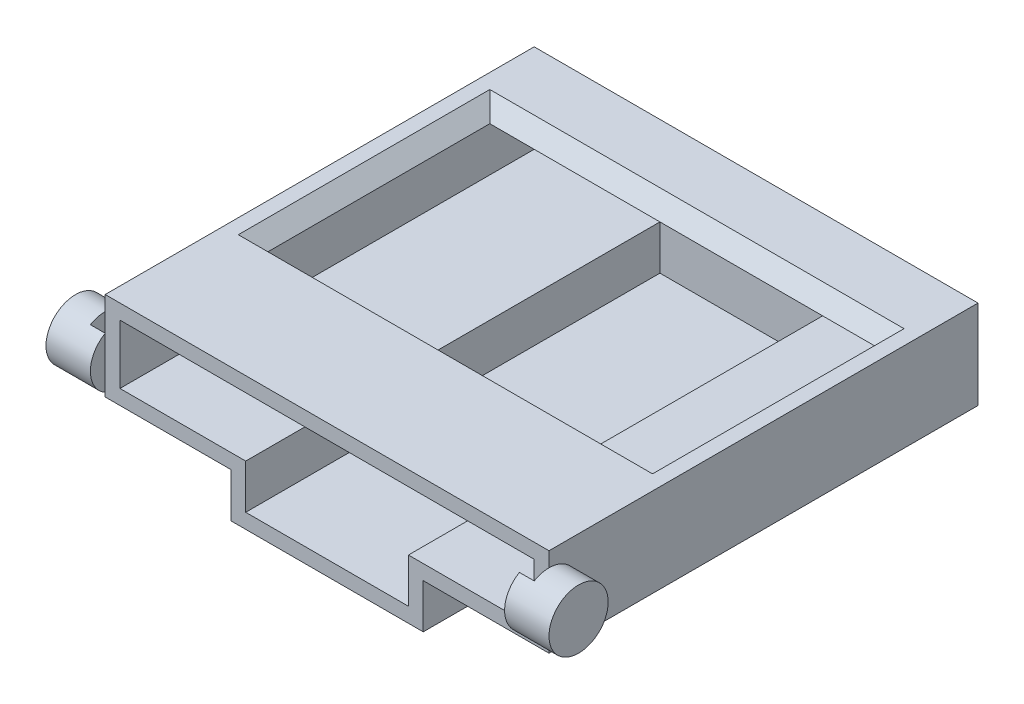
ISO-10303-21;
HEADER;
FILE_DESCRIPTION(('STEP AP214'),'2;1');
FILE_NAME('part.step','',(''),(''),'','','');
FILE_SCHEMA(('AUTOMOTIVE_DESIGN { 1 0 10303 214 1 1 1 1 }'));
ENDSEC;
DATA;
#1=APPLICATION_CONTEXT('core data for automotive mechanical design processes');
#2=APPLICATION_PROTOCOL_DEFINITION('international standard','automotive_design',2000,#1);
#3=PRODUCT_CONTEXT('',#1,'mechanical');
#4=PRODUCT('Part','Part','',(#3));
#5=PRODUCT_RELATED_PRODUCT_CATEGORY('part','',(#4));
#6=PRODUCT_DEFINITION_FORMATION('','',#4);
#7=PRODUCT_DEFINITION_CONTEXT('part definition',#1,'design');
#8=PRODUCT_DEFINITION('design','',#6,#7);
#9=PRODUCT_DEFINITION_SHAPE('','',#8);
#10=(LENGTH_UNIT() NAMED_UNIT(*) SI_UNIT(.MILLI.,.METRE.));
#11=(NAMED_UNIT(*) PLANE_ANGLE_UNIT() SI_UNIT($,.RADIAN.));
#12=(NAMED_UNIT(*) SI_UNIT($,.STERADIAN.) SOLID_ANGLE_UNIT());
#13=UNCERTAINTY_MEASURE_WITH_UNIT(LENGTH_MEASURE(1.E-05),#10,'distance_accuracy_value','');
#14=(GEOMETRIC_REPRESENTATION_CONTEXT(3) GLOBAL_UNCERTAINTY_ASSIGNED_CONTEXT((#13)) GLOBAL_UNIT_ASSIGNED_CONTEXT((#10,
#11,#12)) REPRESENTATION_CONTEXT('',''));
#15=CARTESIAN_POINT('',(0.,0.,0.));
#16=DIRECTION('',(0.,0.,1.));
#17=DIRECTION('',(1.,0.,0.));
#18=AXIS2_PLACEMENT_3D('',#15,#16,#17);
#19=CARTESIAN_POINT('',(1.,6.,0.));
#20=DIRECTION('',(1.,0.,0.));
#21=DIRECTION('',(0.,0.,-1.));
#22=AXIS2_PLACEMENT_3D('',#19,#20,#21);
#23=PLANE('',#22);
#24=DIRECTION('',(0.,1.,0.));
#25=VECTOR('',#24,1.);
#26=CARTESIAN_POINT('',(1.,-1.82620628999741,0.));
#27=LINE('',#26,#25);
#28=CARTESIAN_POINT('',(1.,1.,0.));
#29=VERTEX_POINT('',#28);
#30=CARTESIAN_POINT('',(1.,5.,0.));
#31=VERTEX_POINT('',#30);
#32=EDGE_CURVE('E206',#29,#31,#27,.T.);
#33=ORIENTED_EDGE('',*,*,#32,.F.);
#34=DIRECTION('',(0.,0.,1.));
#35=VECTOR('',#34,1.);
#36=CARTESIAN_POINT('',(1.,1.,0.));
#37=LINE('',#36,#35);
#38=CARTESIAN_POINT('',(1.,1.,-28.));
#39=VERTEX_POINT('',#38);
#40=EDGE_CURVE('E209',#39,#29,#37,.T.);
#41=ORIENTED_EDGE('',*,*,#40,.F.);
#42=DIRECTION('',(0.,-1.,0.));
#43=VECTOR('',#42,1.);
#44=CARTESIAN_POINT('',(1.,6.,-28.));
#45=LINE('',#44,#43);
#46=CARTESIAN_POINT('',(1.,5.,-28.));
#47=VERTEX_POINT('',#46);
#48=EDGE_CURVE('E419',#47,#39,#45,.T.);
#49=ORIENTED_EDGE('',*,*,#48,.F.);
#50=DIRECTION('',(0.,0.,1.));
#51=VECTOR('',#50,1.);
#52=CARTESIAN_POINT('',(1.,5.,0.));
#53=LINE('',#52,#51);
#54=EDGE_CURVE('E211',#47,#31,#53,.T.);
#55=ORIENTED_EDGE('',*,*,#54,.T.);
#56=EDGE_LOOP('',(#33,#41,#49,#55));
#57=FACE_BOUND('',#56,.T.);
#58=ADVANCED_FACE('F32',(#57),#23,.T.);
#59=CARTESIAN_POINT('',(29.,6.,0.));
#60=DIRECTION('',(-1.,0.,0.));
#61=DIRECTION('',(0.,0.,1.));
#62=AXIS2_PLACEMENT_3D('',#59,#60,#61);
#63=PLANE('',#62);
#64=DIRECTION('',(0.,1.,0.));
#65=VECTOR('',#64,1.);
#66=CARTESIAN_POINT('',(29.,0.503232974487844,1.));
#67=LINE('',#66,#65);
#68=CARTESIAN_POINT('',(29.,1.26794919243112,1.));
#69=VERTEX_POINT('',#68);
#70=CARTESIAN_POINT('',(29.,4.73205080756888,1.));
#71=VERTEX_POINT('',#70);
#72=EDGE_CURVE('E335',#69,#71,#67,.T.);
#73=ORIENTED_EDGE('',*,*,#72,.F.);
#74=CARTESIAN_POINT('',(29.,3.,0.));
#75=DIRECTION('',(1.,0.,0.));
#76=DIRECTION('',(0.,0.,-1.));
#77=AXIS2_PLACEMENT_3D('',#74,#75,#76);
#78=CIRCLE('',#77,2.);
#79=EDGE_CURVE('E352',#71,#69,#78,.T.);
#80=ORIENTED_EDGE('',*,*,#79,.F.);
#81=EDGE_LOOP('',(#73,#80));
#82=FACE_BOUND('',#81,.T.);
#83=ADVANCED_FACE('F462',(#82),#63,.T.);
#84=CARTESIAN_POINT('',(0.,1.,0.));
#85=DIRECTION('',(0.,-1.,0.));
#86=DIRECTION('',(0.,0.,-1.));
#87=AXIS2_PLACEMENT_3D('',#84,#85,#86);
#88=PLANE('',#87);
#89=DIRECTION('',(-1.,0.,0.));
#90=VECTOR('',#89,1.);
#91=CARTESIAN_POINT('',(0.,1.,-28.));
#92=LINE('',#91,#90);
#93=CARTESIAN_POINT('',(29.,1.,-28.));
#94=VERTEX_POINT('',#93);
#95=CARTESIAN_POINT('',(20.5,1.,-28.));
#96=VERTEX_POINT('',#95);
#97=EDGE_CURVE('E418',#94,#96,#92,.T.);
#98=ORIENTED_EDGE('',*,*,#97,.T.);
#99=DIRECTION('',(0.,0.,-1.));
#100=VECTOR('',#99,1.);
#101=CARTESIAN_POINT('',(20.5,1.,0.));
#102=LINE('',#101,#100);
#103=CARTESIAN_POINT('',(20.5,1.,0.));
#104=VERTEX_POINT('',#103);
#105=EDGE_CURVE('E358',#104,#96,#102,.T.);
#106=ORIENTED_EDGE('',*,*,#105,.F.);
#107=DIRECTION('',(1.,0.,0.));
#108=VECTOR('',#107,1.);
#109=CARTESIAN_POINT('',(0.,1.,0.));
#110=LINE('',#109,#108);
#111=CARTESIAN_POINT('',(29.,1.,0.));
#112=VERTEX_POINT('',#111);
#113=EDGE_CURVE('E226',#104,#112,#110,.T.);
#114=ORIENTED_EDGE('',*,*,#113,.T.);
#115=DIRECTION('',(0.,0.,-1.));
#116=VECTOR('',#115,1.);
#117=CARTESIAN_POINT('',(29.,1.,0.));
#118=LINE('',#117,#116);
#119=EDGE_CURVE('E234',#112,#94,#118,.T.);
#120=ORIENTED_EDGE('',*,*,#119,.T.);
#121=EDGE_LOOP('',(#98,#106,#114,#120));
#122=FACE_BOUND('',#121,.T.);
#123=ADVANCED_FACE('F438',(#122),#88,.F.);
#124=CARTESIAN_POINT('',(0.,0.,0.));
#125=DIRECTION('',(0.,-1.,0.));
#126=DIRECTION('',(0.,0.,-1.));
#127=AXIS2_PLACEMENT_3D('',#124,#125,#126);
#128=PLANE('',#127);
#129=DIRECTION('',(0.,0.,-1.));
#130=VECTOR('',#129,1.);
#131=CARTESIAN_POINT('',(8.5,0.,0.));
#132=LINE('',#131,#130);
#133=CARTESIAN_POINT('',(8.5,0.,0.));
#134=VERTEX_POINT('',#133);
#135=CARTESIAN_POINT('',(8.5,0.,-29.));
#136=VERTEX_POINT('',#135);
#137=EDGE_CURVE('E377',#134,#136,#132,.T.);
#138=ORIENTED_EDGE('',*,*,#137,.F.);
#139=DIRECTION('',(1.,0.,0.));
#140=VECTOR('',#139,1.);
#141=CARTESIAN_POINT('',(0.,0.,0.));
#142=LINE('',#141,#140);
#143=CARTESIAN_POINT('',(0.,0.,0.));
#144=VERTEX_POINT('',#143);
#145=EDGE_CURVE('E259',#144,#134,#142,.T.);
#146=ORIENTED_EDGE('',*,*,#145,.F.);
#147=DIRECTION('',(0.,0.,1.));
#148=VECTOR('',#147,1.);
#149=CARTESIAN_POINT('',(0.,0.,0.));
#150=LINE('',#149,#148);
#151=CARTESIAN_POINT('',(0.,0.,-29.));
#152=VERTEX_POINT('',#151);
#153=EDGE_CURVE('E254',#152,#144,#150,.T.);
#154=ORIENTED_EDGE('',*,*,#153,.F.);
#155=DIRECTION('',(-1.,0.,0.));
#156=VECTOR('',#155,1.);
#157=CARTESIAN_POINT('',(0.,0.,-29.));
#158=LINE('',#157,#156);
#159=EDGE_CURVE('E263',#136,#152,#158,.T.);
#160=ORIENTED_EDGE('',*,*,#159,.F.);
#161=EDGE_LOOP('',(#138,#146,#154,#160));
#162=FACE_BOUND('',#161,.T.);
#163=ADVANCED_FACE('F481',(#162),#128,.T.);
#164=CARTESIAN_POINT('',(0.,6.,0.));
#165=DIRECTION('',(0.,0.,-1.));
#166=DIRECTION('',(-1.,0.,0.));
#167=AXIS2_PLACEMENT_3D('',#164,#165,#166);
#168=PLANE('',#167);
#169=ORIENTED_EDGE('',*,*,#32,.T.);
#170=DIRECTION('',(1.,0.,0.));
#171=VECTOR('',#170,1.);
#172=CARTESIAN_POINT('',(0.,5.,0.));
#173=LINE('',#172,#171);
#174=CARTESIAN_POINT('',(29.,5.,0.));
#175=VERTEX_POINT('',#174);
#176=EDGE_CURVE('E241',#31,#175,#173,.T.);
#177=ORIENTED_EDGE('',*,*,#176,.T.);
#178=DIRECTION('',(0.,-1.,0.));
#179=VECTOR('',#178,1.);
#180=CARTESIAN_POINT('',(29.,0.503232974487844,0.));
#181=LINE('',#180,#179);
#182=EDGE_CURVE('E340',#175,#112,#181,.T.);
#183=ORIENTED_EDGE('',*,*,#182,.T.);
#184=ORIENTED_EDGE('',*,*,#113,.F.);
#185=DIRECTION('',(0.,1.,0.));
#186=VECTOR('',#185,1.);
#187=CARTESIAN_POINT('',(20.5,-2.,0.));
#188=LINE('',#187,#186);
#189=CARTESIAN_POINT('',(20.5,-2.,0.));
#190=VERTEX_POINT('',#189);
#191=EDGE_CURVE('E375',#190,#104,#188,.T.);
#192=ORIENTED_EDGE('',*,*,#191,.F.);
#193=DIRECTION('',(1.,0.,0.));
#194=VECTOR('',#193,1.);
#195=CARTESIAN_POINT('',(20.5,-2.,0.));
#196=LINE('',#195,#194);
#197=CARTESIAN_POINT('',(9.5,-2.,0.));
#198=VERTEX_POINT('',#197);
#199=EDGE_CURVE('E369',#198,#190,#196,.T.);
#200=ORIENTED_EDGE('',*,*,#199,.F.);
#201=DIRECTION('',(0.,1.,0.));
#202=VECTOR('',#201,1.);
#203=CARTESIAN_POINT('',(9.5,-2.,0.));
#204=LINE('',#203,#202);
#205=CARTESIAN_POINT('',(9.5,1.,0.));
#206=VERTEX_POINT('',#205);
#207=EDGE_CURVE('E233',#198,#206,#204,.T.);
#208=ORIENTED_EDGE('',*,*,#207,.T.);
#209=EDGE_CURVE('E222',#29,#206,#110,.T.);
#210=ORIENTED_EDGE('',*,*,#209,.F.);
#211=EDGE_LOOP('',(#169,#177,#183,#184,#192,#200,#208,#210));
#212=FACE_BOUND('',#211,.T.);
#213=DIRECTION('',(0.,-1.,0.));
#214=VECTOR('',#213,1.);
#215=CARTESIAN_POINT('',(30.,6.,0.));
#216=LINE('',#215,#214);
#217=CARTESIAN_POINT('',(30.,6.,0.));
#218=VERTEX_POINT('',#217);
#219=CARTESIAN_POINT('',(30.,5.,0.));
#220=VERTEX_POINT('',#219);
#221=EDGE_CURVE('E272',#218,#220,#216,.T.);
#222=ORIENTED_EDGE('',*,*,#221,.F.);
#223=DIRECTION('',(1.,0.,0.));
#224=VECTOR('',#223,1.);
#225=CARTESIAN_POINT('',(0.,6.,0.));
#226=LINE('',#225,#224);
#227=CARTESIAN_POINT('',(0.,6.,0.));
#228=VERTEX_POINT('',#227);
#229=EDGE_CURVE('E246',#228,#218,#226,.T.);
#230=ORIENTED_EDGE('',*,*,#229,.F.);
#231=DIRECTION('',(0.,-1.,0.));
#232=VECTOR('',#231,1.);
#233=CARTESIAN_POINT('',(0.,6.,0.));
#234=LINE('',#233,#232);
#235=CARTESIAN_POINT('',(0.,5.,0.));
#236=VERTEX_POINT('',#235);
#237=EDGE_CURVE('E276',#228,#236,#234,.T.);
#238=ORIENTED_EDGE('',*,*,#237,.T.);
#239=DIRECTION('',(0.,1.,0.));
#240=VECTOR('',#239,1.);
#241=CARTESIAN_POINT('',(0.,-1.82620628999741,0.));
#242=LINE('',#241,#240);
#243=CARTESIAN_POINT('',(0.,1.,0.));
#244=VERTEX_POINT('',#243);
#245=EDGE_CURVE('E329',#244,#236,#242,.T.);
#246=ORIENTED_EDGE('',*,*,#245,.F.);
#247=EDGE_CURVE('E275',#244,#144,#234,.T.);
#248=ORIENTED_EDGE('',*,*,#247,.T.);
#249=ORIENTED_EDGE('',*,*,#145,.T.);
#250=DIRECTION('',(0.,1.,0.));
#251=VECTOR('',#250,1.);
#252=CARTESIAN_POINT('',(8.5,-3.,0.));
#253=LINE('',#252,#251);
#254=CARTESIAN_POINT('',(8.5,-3.,0.));
#255=VERTEX_POINT('',#254);
#256=EDGE_CURVE('E393',#255,#134,#253,.T.);
#257=ORIENTED_EDGE('',*,*,#256,.F.);
#258=DIRECTION('',(-1.,0.,0.));
#259=VECTOR('',#258,1.);
#260=CARTESIAN_POINT('',(8.5,-3.,0.));
#261=LINE('',#260,#259);
#262=CARTESIAN_POINT('',(21.5,-3.,0.));
#263=VERTEX_POINT('',#262);
#264=EDGE_CURVE('E391',#263,#255,#261,.T.);
#265=ORIENTED_EDGE('',*,*,#264,.F.);
#266=DIRECTION('',(0.,1.,0.));
#267=VECTOR('',#266,1.);
#268=CARTESIAN_POINT('',(21.5,-3.,0.));
#269=LINE('',#268,#267);
#270=CARTESIAN_POINT('',(21.5,0.,0.));
#271=VERTEX_POINT('',#270);
#272=EDGE_CURVE('E400',#263,#271,#269,.T.);
#273=ORIENTED_EDGE('',*,*,#272,.T.);
#274=CARTESIAN_POINT('',(30.,0.,0.));
#275=VERTEX_POINT('',#274);
#276=EDGE_CURVE('E257',#271,#275,#142,.T.);
#277=ORIENTED_EDGE('',*,*,#276,.T.);
#278=CARTESIAN_POINT('',(30.,1.,0.));
#279=VERTEX_POINT('',#278);
#280=EDGE_CURVE('E271',#279,#275,#216,.T.);
#281=ORIENTED_EDGE('',*,*,#280,.F.);
#282=DIRECTION('',(0.,-1.,0.));
#283=VECTOR('',#282,1.);
#284=CARTESIAN_POINT('',(30.,0.503232974487844,0.));
#285=LINE('',#284,#283);
#286=EDGE_CURVE('E291',#220,#279,#285,.T.);
#287=ORIENTED_EDGE('',*,*,#286,.F.);
#288=EDGE_LOOP('',(#222,#230,#238,#246,#248,#249,#257,#265,#273,#277,#281,#287));
#289=FACE_BOUND('',#288,.T.);
#290=ADVANCED_FACE('F230',(#212,#289),#168,.F.);
#291=CARTESIAN_POINT('',(0.,6.,0.));
#292=DIRECTION('',(1.,0.,0.));
#293=DIRECTION('',(0.,0.,-1.));
#294=AXIS2_PLACEMENT_3D('',#291,#292,#293);
#295=PLANE('',#294);
#296=ORIENTED_EDGE('',*,*,#247,.F.);
#297=CARTESIAN_POINT('',(0.,3.,0.));
#298=DIRECTION('',(1.,0.,0.));
#299=DIRECTION('',(0.,0.,-1.));
#300=AXIS2_PLACEMENT_3D('',#297,#298,#299);
#301=CIRCLE('',#300,2.);
#302=EDGE_CURVE('E323',#244,#236,#301,.T.);
#303=ORIENTED_EDGE('',*,*,#302,.T.);
#304=ORIENTED_EDGE('',*,*,#237,.F.);
#305=DIRECTION('',(0.,0.,1.));
#306=VECTOR('',#305,1.);
#307=CARTESIAN_POINT('',(0.,6.,0.));
#308=LINE('',#307,#306);
#309=CARTESIAN_POINT('',(0.,6.,-29.));
#310=VERTEX_POINT('',#309);
#311=EDGE_CURVE('E243',#310,#228,#308,.T.);
#312=ORIENTED_EDGE('',*,*,#311,.F.);
#313=DIRECTION('',(0.,-1.,0.));
#314=VECTOR('',#313,1.);
#315=CARTESIAN_POINT('',(0.,6.,-29.));
#316=LINE('',#315,#314);
#317=EDGE_CURVE('E253',#310,#152,#316,.T.);
#318=ORIENTED_EDGE('',*,*,#317,.T.);
#319=ORIENTED_EDGE('',*,*,#153,.T.);
#320=EDGE_LOOP('',(#296,#303,#304,#312,#318,#319));
#321=FACE_BOUND('',#320,.T.);
#322=ADVANCED_FACE('F483',(#321),#295,.F.);
#323=CARTESIAN_POINT('',(30.,6.,0.));
#324=DIRECTION('',(-1.,0.,0.));
#325=DIRECTION('',(0.,0.,1.));
#326=AXIS2_PLACEMENT_3D('',#323,#324,#325);
#327=PLANE('',#326);
#328=ORIENTED_EDGE('',*,*,#221,.T.);
#329=CARTESIAN_POINT('',(30.,3.,0.));
#330=DIRECTION('',(-1.,0.,0.));
#331=DIRECTION('',(0.,0.,1.));
#332=AXIS2_PLACEMENT_3D('',#329,#330,#331);
#333=CIRCLE('',#332,2.);
#334=EDGE_CURVE('E355',#220,#279,#333,.T.);
#335=ORIENTED_EDGE('',*,*,#334,.T.);
#336=ORIENTED_EDGE('',*,*,#280,.T.);
#337=DIRECTION('',(0.,0.,-1.));
#338=VECTOR('',#337,1.);
#339=CARTESIAN_POINT('',(30.,0.,0.));
#340=LINE('',#339,#338);
#341=CARTESIAN_POINT('',(30.,0.,-29.));
#342=VERTEX_POINT('',#341);
#343=EDGE_CURVE('E261',#275,#342,#340,.T.);
#344=ORIENTED_EDGE('',*,*,#343,.T.);
#345=DIRECTION('',(0.,-1.,0.));
#346=VECTOR('',#345,1.);
#347=CARTESIAN_POINT('',(30.,6.,-29.));
#348=LINE('',#347,#346);
#349=CARTESIAN_POINT('',(30.,6.,-29.));
#350=VERTEX_POINT('',#349);
#351=EDGE_CURVE('E268',#350,#342,#348,.T.);
#352=ORIENTED_EDGE('',*,*,#351,.F.);
#353=DIRECTION('',(0.,0.,-1.));
#354=VECTOR('',#353,1.);
#355=CARTESIAN_POINT('',(30.,6.,0.));
#356=LINE('',#355,#354);
#357=EDGE_CURVE('E249',#218,#350,#356,.T.);
#358=ORIENTED_EDGE('',*,*,#357,.F.);
#359=EDGE_LOOP('',(#328,#335,#336,#344,#352,#358));
#360=FACE_BOUND('',#359,.T.);
#361=ADVANCED_FACE('F506',(#360),#327,.F.);
#362=CARTESIAN_POINT('',(0.,6.,-29.));
#363=DIRECTION('',(0.,0.,1.));
#364=DIRECTION('',(1.,0.,0.));
#365=AXIS2_PLACEMENT_3D('',#362,#363,#364);
#366=PLANE('',#365);
#367=CARTESIAN_POINT('',(21.5,0.,-29.));
#368=VERTEX_POINT('',#367);
#369=EDGE_CURVE('E247',#342,#368,#158,.T.);
#370=ORIENTED_EDGE('',*,*,#369,.T.);
#371=DIRECTION('',(0.,1.,0.));
#372=VECTOR('',#371,1.);
#373=CARTESIAN_POINT('',(21.5,-3.,-29.));
#374=LINE('',#373,#372);
#375=CARTESIAN_POINT('',(21.5,-3.,-29.));
#376=VERTEX_POINT('',#375);
#377=EDGE_CURVE('E403',#376,#368,#374,.T.);
#378=ORIENTED_EDGE('',*,*,#377,.F.);
#379=DIRECTION('',(1.,0.,0.));
#380=VECTOR('',#379,1.);
#381=CARTESIAN_POINT('',(8.50000000000001,-3.,-29.));
#382=LINE('',#381,#380);
#383=CARTESIAN_POINT('',(8.50000000000001,-3.,-29.));
#384=VERTEX_POINT('',#383);
#385=EDGE_CURVE('E386',#384,#376,#382,.T.);
#386=ORIENTED_EDGE('',*,*,#385,.F.);
#387=DIRECTION('',(0.,1.,0.));
#388=VECTOR('',#387,1.);
#389=CARTESIAN_POINT('',(8.50000000000001,-3.,-29.));
#390=LINE('',#389,#388);
#391=EDGE_CURVE('E406',#384,#136,#390,.T.);
#392=ORIENTED_EDGE('',*,*,#391,.T.);
#393=ORIENTED_EDGE('',*,*,#159,.T.);
#394=ORIENTED_EDGE('',*,*,#317,.F.);
#395=DIRECTION('',(-1.,0.,0.));
#396=VECTOR('',#395,1.);
#397=CARTESIAN_POINT('',(0.,6.,-29.));
#398=LINE('',#397,#396);
#399=EDGE_CURVE('E251',#350,#310,#398,.T.);
#400=ORIENTED_EDGE('',*,*,#399,.F.);
#401=ORIENTED_EDGE('',*,*,#351,.T.);
#402=EDGE_LOOP('',(#370,#378,#386,#392,#393,#394,#400,#401));
#403=FACE_BOUND('',#402,.T.);
#404=ADVANCED_FACE('F510',(#403),#366,.F.);
#405=CARTESIAN_POINT('',(0.,6.,0.));
#406=DIRECTION('',(0.,-1.,0.));
#407=DIRECTION('',(0.,0.,-1.));
#408=AXIS2_PLACEMENT_3D('',#405,#406,#407);
#409=PLANE('',#408);
#410=DIRECTION('',(1.,0.,0.));
#411=VECTOR('',#410,1.);
#412=CARTESIAN_POINT('',(0.,6.,-25.));
#413=LINE('',#412,#411);
#414=CARTESIAN_POINT('',(0.999999999999999,6.,-25.));
#415=VERTEX_POINT('',#414);
#416=CARTESIAN_POINT('',(29.,6.,-25.));
#417=VERTEX_POINT('',#416);
#418=EDGE_CURVE('E279',#415,#417,#413,.T.);
#419=ORIENTED_EDGE('',*,*,#418,.T.);
#420=DIRECTION('',(0.,0.,1.));
#421=VECTOR('',#420,1.);
#422=CARTESIAN_POINT('',(29.,6.,0.));
#423=LINE('',#422,#421);
#424=CARTESIAN_POINT('',(29.,6.,-8.));
#425=VERTEX_POINT('',#424);
#426=EDGE_CURVE('E285',#417,#425,#423,.T.);
#427=ORIENTED_EDGE('',*,*,#426,.T.);
#428=DIRECTION('',(-1.,0.,0.));
#429=VECTOR('',#428,1.);
#430=CARTESIAN_POINT('',(0.,6.,-8.));
#431=LINE('',#430,#429);
#432=CARTESIAN_POINT('',(0.999999999999999,6.,-8.));
#433=VERTEX_POINT('',#432);
#434=EDGE_CURVE('E283',#425,#433,#431,.T.);
#435=ORIENTED_EDGE('',*,*,#434,.T.);
#436=DIRECTION('',(0.,0.,-1.));
#437=VECTOR('',#436,1.);
#438=CARTESIAN_POINT('',(0.999999999999999,6.,0.));
#439=LINE('',#438,#437);
#440=EDGE_CURVE('E281',#433,#415,#439,.T.);
#441=ORIENTED_EDGE('',*,*,#440,.T.);
#442=EDGE_LOOP('',(#419,#427,#435,#441));
#443=FACE_BOUND('',#442,.T.);
#444=ORIENTED_EDGE('',*,*,#311,.T.);
#445=ORIENTED_EDGE('',*,*,#229,.T.);
#446=ORIENTED_EDGE('',*,*,#357,.T.);
#447=ORIENTED_EDGE('',*,*,#399,.T.);
#448=EDGE_LOOP('',(#444,#445,#446,#447));
#449=FACE_BOUND('',#448,.T.);
#450=ADVANCED_FACE('F478',(#443,#449),#409,.F.);
#451=DIRECTION('',(0.,0.,1.));
#452=VECTOR('',#451,1.);
#453=CARTESIAN_POINT('',(21.5,0.,0.));
#454=LINE('',#453,#452);
#455=EDGE_CURVE('E387',#368,#271,#454,.T.);
#456=ORIENTED_EDGE('',*,*,#455,.F.);
#457=ORIENTED_EDGE('',*,*,#369,.F.);
#458=ORIENTED_EDGE('',*,*,#343,.F.);
#459=ORIENTED_EDGE('',*,*,#276,.F.);
#460=EDGE_LOOP('',(#456,#457,#458,#459));
#461=FACE_BOUND('',#460,.T.);
#462=ADVANCED_FACE('F472',(#461),#128,.T.);
#463=DIRECTION('',(0.,-1.,0.));
#464=VECTOR('',#463,1.);
#465=CARTESIAN_POINT('',(1.,-1.82620628999741,1.));
#466=LINE('',#465,#464);
#467=CARTESIAN_POINT('',(1.,4.73205080756888,1.));
#468=VERTEX_POINT('',#467);
#469=CARTESIAN_POINT('',(1.,1.26794919243112,1.));
#470=VERTEX_POINT('',#469);
#471=EDGE_CURVE('E216',#468,#470,#466,.T.);
#472=ORIENTED_EDGE('',*,*,#471,.F.);
#473=CARTESIAN_POINT('',(1.,3.,0.));
#474=DIRECTION('',(-1.,0.,0.));
#475=DIRECTION('',(0.,0.,1.));
#476=AXIS2_PLACEMENT_3D('',#473,#474,#475);
#477=CIRCLE('',#476,2.);
#478=EDGE_CURVE('E346',#470,#468,#477,.T.);
#479=ORIENTED_EDGE('',*,*,#478,.F.);
#480=EDGE_LOOP('',(#472,#479));
#481=FACE_BOUND('',#480,.T.);
#482=ADVANCED_FACE('F464',(#481),#23,.T.);
#483=ORIENTED_EDGE('',*,*,#182,.F.);
#484=DIRECTION('',(0.,0.,-1.));
#485=VECTOR('',#484,1.);
#486=CARTESIAN_POINT('',(29.,5.,0.));
#487=LINE('',#486,#485);
#488=CARTESIAN_POINT('',(29.,5.,-28.));
#489=VERTEX_POINT('',#488);
#490=EDGE_CURVE('E240',#175,#489,#487,.T.);
#491=ORIENTED_EDGE('',*,*,#490,.T.);
#492=DIRECTION('',(0.,-1.,0.));
#493=VECTOR('',#492,1.);
#494=CARTESIAN_POINT('',(29.,6.,-28.));
#495=LINE('',#494,#493);
#496=EDGE_CURVE('E258',#489,#94,#495,.T.);
#497=ORIENTED_EDGE('',*,*,#496,.T.);
#498=ORIENTED_EDGE('',*,*,#119,.F.);
#499=EDGE_LOOP('',(#483,#491,#497,#498));
#500=FACE_BOUND('',#499,.T.);
#501=ADVANCED_FACE('F430',(#500),#63,.T.);
#502=CARTESIAN_POINT('',(0.,6.,-28.));
#503=DIRECTION('',(0.,0.,1.));
#504=DIRECTION('',(1.,0.,0.));
#505=AXIS2_PLACEMENT_3D('',#502,#503,#504);
#506=PLANE('',#505);
#507=ORIENTED_EDGE('',*,*,#97,.F.);
#508=ORIENTED_EDGE('',*,*,#496,.F.);
#509=DIRECTION('',(-1.,0.,0.));
#510=VECTOR('',#509,1.);
#511=CARTESIAN_POINT('',(0.,5.,-28.));
#512=LINE('',#511,#510);
#513=EDGE_CURVE('E421',#489,#47,#512,.T.);
#514=ORIENTED_EDGE('',*,*,#513,.T.);
#515=ORIENTED_EDGE('',*,*,#48,.T.);
#516=CARTESIAN_POINT('',(9.5,1.,-28.));
#517=VERTEX_POINT('',#516);
#518=EDGE_CURVE('E224',#517,#39,#92,.T.);
#519=ORIENTED_EDGE('',*,*,#518,.F.);
#520=DIRECTION('',(0.,1.,0.));
#521=VECTOR('',#520,1.);
#522=CARTESIAN_POINT('',(9.5,-2.,-28.));
#523=LINE('',#522,#521);
#524=CARTESIAN_POINT('',(9.5,-2.,-28.));
#525=VERTEX_POINT('',#524);
#526=EDGE_CURVE('E379',#525,#517,#523,.T.);
#527=ORIENTED_EDGE('',*,*,#526,.F.);
#528=DIRECTION('',(-1.,0.,0.));
#529=VECTOR('',#528,1.);
#530=CARTESIAN_POINT('',(20.5,-2.,-28.));
#531=LINE('',#530,#529);
#532=CARTESIAN_POINT('',(20.5,-2.,-28.));
#533=VERTEX_POINT('',#532);
#534=EDGE_CURVE('E362',#533,#525,#531,.T.);
#535=ORIENTED_EDGE('',*,*,#534,.F.);
#536=DIRECTION('',(0.,1.,0.));
#537=VECTOR('',#536,1.);
#538=CARTESIAN_POINT('',(20.5,-2.,-28.));
#539=LINE('',#538,#537);
#540=EDGE_CURVE('E372',#533,#96,#539,.T.);
#541=ORIENTED_EDGE('',*,*,#540,.T.);
#542=EDGE_LOOP('',(#507,#508,#514,#515,#519,#527,#535,#541));
#543=FACE_BOUND('',#542,.T.);
#544=ADVANCED_FACE('F434',(#543),#506,.T.);
#545=CARTESIAN_POINT('',(0.,5.,0.));
#546=DIRECTION('',(0.,-1.,0.));
#547=DIRECTION('',(0.,0.,-1.));
#548=AXIS2_PLACEMENT_3D('',#545,#546,#547);
#549=PLANE('',#548);
#550=DIRECTION('',(0.,0.,1.));
#551=VECTOR('',#550,1.);
#552=CARTESIAN_POINT('',(2.,5.,-24.));
#553=LINE('',#552,#551);
#554=CARTESIAN_POINT('',(2.,5.,-24.));
#555=VERTEX_POINT('',#554);
#556=CARTESIAN_POINT('',(2.,5.,-9.));
#557=VERTEX_POINT('',#556);
#558=EDGE_CURVE('E409',#555,#557,#553,.T.);
#559=ORIENTED_EDGE('',*,*,#558,.T.);
#560=DIRECTION('',(1.,0.,0.));
#561=VECTOR('',#560,1.);
#562=CARTESIAN_POINT('',(2.,5.,-9.));
#563=LINE('',#562,#561);
#564=CARTESIAN_POINT('',(28.,5.,-9.));
#565=VERTEX_POINT('',#564);
#566=EDGE_CURVE('E227',#557,#565,#563,.T.);
#567=ORIENTED_EDGE('',*,*,#566,.T.);
#568=DIRECTION('',(0.,0.,-1.));
#569=VECTOR('',#568,1.);
#570=CARTESIAN_POINT('',(28.,5.,-24.));
#571=LINE('',#570,#569);
#572=CARTESIAN_POINT('',(28.,5.,-24.));
#573=VERTEX_POINT('',#572);
#574=EDGE_CURVE('E411',#565,#573,#571,.T.);
#575=ORIENTED_EDGE('',*,*,#574,.T.);
#576=DIRECTION('',(-1.,0.,0.));
#577=VECTOR('',#576,1.);
#578=CARTESIAN_POINT('',(2.,5.,-24.));
#579=LINE('',#578,#577);
#580=EDGE_CURVE('E413',#573,#555,#579,.T.);
#581=ORIENTED_EDGE('',*,*,#580,.T.);
#582=EDGE_LOOP('',(#559,#567,#575,#581));
#583=FACE_BOUND('',#582,.T.);
#584=ORIENTED_EDGE('',*,*,#54,.F.);
#585=ORIENTED_EDGE('',*,*,#513,.F.);
#586=ORIENTED_EDGE('',*,*,#490,.F.);
#587=ORIENTED_EDGE('',*,*,#176,.F.);
#588=EDGE_LOOP('',(#584,#585,#586,#587));
#589=FACE_BOUND('',#588,.T.);
#590=ADVANCED_FACE('F442',(#583,#589),#549,.T.);
#591=ORIENTED_EDGE('',*,*,#209,.T.);
#592=DIRECTION('',(0.,0.,1.));
#593=VECTOR('',#592,1.);
#594=CARTESIAN_POINT('',(9.5,1.,0.));
#595=LINE('',#594,#593);
#596=EDGE_CURVE('E363',#517,#206,#595,.T.);
#597=ORIENTED_EDGE('',*,*,#596,.F.);
#598=ORIENTED_EDGE('',*,*,#518,.T.);
#599=ORIENTED_EDGE('',*,*,#40,.T.);
#600=EDGE_LOOP('',(#591,#597,#598,#599));
#601=FACE_BOUND('',#600,.T.);
#602=ADVANCED_FACE('F220',(#601),#88,.F.);
#603=CARTESIAN_POINT('',(8.5,-3.,0.));
#604=DIRECTION('',(1.,0.,0.));
#605=DIRECTION('',(0.,0.,-1.));
#606=AXIS2_PLACEMENT_3D('',#603,#604,#605);
#607=PLANE('',#606);
#608=ORIENTED_EDGE('',*,*,#137,.T.);
#609=ORIENTED_EDGE('',*,*,#391,.F.);
#610=DIRECTION('',(0.,0.,-1.));
#611=VECTOR('',#610,1.);
#612=CARTESIAN_POINT('',(8.5,-3.,0.));
#613=LINE('',#612,#611);
#614=EDGE_CURVE('E383',#255,#384,#613,.T.);
#615=ORIENTED_EDGE('',*,*,#614,.F.);
#616=ORIENTED_EDGE('',*,*,#256,.T.);
#617=EDGE_LOOP('',(#608,#609,#615,#616));
#618=FACE_BOUND('',#617,.T.);
#619=ADVANCED_FACE('F494',(#618),#607,.F.);
#620=CARTESIAN_POINT('',(21.5,-3.,0.));
#621=DIRECTION('',(-1.,0.,0.));
#622=DIRECTION('',(0.,0.,1.));
#623=AXIS2_PLACEMENT_3D('',#620,#621,#622);
#624=PLANE('',#623);
#625=ORIENTED_EDGE('',*,*,#455,.T.);
#626=ORIENTED_EDGE('',*,*,#272,.F.);
#627=DIRECTION('',(0.,0.,1.));
#628=VECTOR('',#627,1.);
#629=CARTESIAN_POINT('',(21.5,-3.,0.));
#630=LINE('',#629,#628);
#631=EDGE_CURVE('E389',#376,#263,#630,.T.);
#632=ORIENTED_EDGE('',*,*,#631,.F.);
#633=ORIENTED_EDGE('',*,*,#377,.T.);
#634=EDGE_LOOP('',(#625,#626,#632,#633));
#635=FACE_BOUND('',#634,.T.);
#636=ADVANCED_FACE('F458',(#635),#624,.F.);
#637=CARTESIAN_POINT('',(0.,-3.,0.));
#638=DIRECTION('',(0.,-1.,0.));
#639=DIRECTION('',(0.,0.,-1.));
#640=AXIS2_PLACEMENT_3D('',#637,#638,#639);
#641=PLANE('',#640);
#642=ORIENTED_EDGE('',*,*,#614,.T.);
#643=ORIENTED_EDGE('',*,*,#385,.T.);
#644=ORIENTED_EDGE('',*,*,#631,.T.);
#645=ORIENTED_EDGE('',*,*,#264,.T.);
#646=EDGE_LOOP('',(#642,#643,#644,#645));
#647=FACE_BOUND('',#646,.T.);
#648=ADVANCED_FACE('F451',(#647),#641,.T.);
#649=CARTESIAN_POINT('',(20.5,-2.,0.));
#650=DIRECTION('',(1.,0.,0.));
#651=DIRECTION('',(0.,0.,-1.));
#652=AXIS2_PLACEMENT_3D('',#649,#650,#651);
#653=PLANE('',#652);
#654=ORIENTED_EDGE('',*,*,#105,.T.);
#655=ORIENTED_EDGE('',*,*,#540,.F.);
#656=DIRECTION('',(0.,0.,-1.));
#657=VECTOR('',#656,1.);
#658=CARTESIAN_POINT('',(20.5,-2.,0.));
#659=LINE('',#658,#657);
#660=EDGE_CURVE('E359',#190,#533,#659,.T.);
#661=ORIENTED_EDGE('',*,*,#660,.F.);
#662=ORIENTED_EDGE('',*,*,#191,.T.);
#663=EDGE_LOOP('',(#654,#655,#661,#662));
#664=FACE_BOUND('',#663,.T.);
#665=ADVANCED_FACE('F449',(#664),#653,.F.);
#666=CARTESIAN_POINT('',(9.5,-2.,0.));
#667=DIRECTION('',(-1.,0.,0.));
#668=DIRECTION('',(0.,0.,1.));
#669=AXIS2_PLACEMENT_3D('',#666,#667,#668);
#670=PLANE('',#669);
#671=ORIENTED_EDGE('',*,*,#596,.T.);
#672=ORIENTED_EDGE('',*,*,#207,.F.);
#673=DIRECTION('',(0.,0.,1.));
#674=VECTOR('',#673,1.);
#675=CARTESIAN_POINT('',(9.5,-2.,0.));
#676=LINE('',#675,#674);
#677=EDGE_CURVE('E366',#525,#198,#676,.T.);
#678=ORIENTED_EDGE('',*,*,#677,.F.);
#679=ORIENTED_EDGE('',*,*,#526,.T.);
#680=EDGE_LOOP('',(#671,#672,#678,#679));
#681=FACE_BOUND('',#680,.T.);
#682=ADVANCED_FACE('F445',(#681),#670,.F.);
#683=CARTESIAN_POINT('',(0.,-2.,0.));
#684=DIRECTION('',(0.,1.,0.));
#685=DIRECTION('',(0.,0.,1.));
#686=AXIS2_PLACEMENT_3D('',#683,#684,#685);
#687=PLANE('',#686);
#688=ORIENTED_EDGE('',*,*,#660,.T.);
#689=ORIENTED_EDGE('',*,*,#534,.T.);
#690=ORIENTED_EDGE('',*,*,#677,.T.);
#691=ORIENTED_EDGE('',*,*,#199,.T.);
#692=EDGE_LOOP('',(#688,#689,#690,#691));
#693=FACE_BOUND('',#692,.T.);
#694=ADVANCED_FACE('F447',(#693),#687,.T.);
#695=CARTESIAN_POINT('',(29.,3.,0.));
#696=DIRECTION('',(1.,0.,0.));
#697=DIRECTION('',(0.,0.,-1.));
#698=AXIS2_PLACEMENT_3D('',#695,#696,#697);
#699=CYLINDRICAL_SURFACE('',#698,2.);
#700=DIRECTION('',(1.,0.,0.));
#701=VECTOR('',#700,1.);
#702=CARTESIAN_POINT('',(29.,1.26794919243112,1.));
#703=LINE('',#702,#701);
#704=CARTESIAN_POINT('',(30.,1.26794919243112,1.));
#705=VERTEX_POINT('',#704);
#706=EDGE_CURVE('E305',#705,#69,#703,.F.);
#707=ORIENTED_EDGE('',*,*,#706,.F.);
#708=CARTESIAN_POINT('',(30.,3.,0.));
#709=DIRECTION('',(-1.,0.,0.));
#710=DIRECTION('',(0.,0.,1.));
#711=AXIS2_PLACEMENT_3D('',#708,#709,#710);
#712=CIRCLE('',#711,2.);
#713=EDGE_CURVE('E303',#705,#279,#712,.F.);
#714=ORIENTED_EDGE('',*,*,#713,.T.);
#715=ORIENTED_EDGE('',*,*,#334,.F.);
#716=CARTESIAN_POINT('',(30.,4.73205080756888,1.));
#717=VERTEX_POINT('',#716);
#718=EDGE_CURVE('E288',#220,#717,#712,.F.);
#719=ORIENTED_EDGE('',*,*,#718,.T.);
#720=DIRECTION('',(1.,0.,0.));
#721=VECTOR('',#720,1.);
#722=CARTESIAN_POINT('',(29.,4.73205080756888,1.));
#723=LINE('',#722,#721);
#724=EDGE_CURVE('E302',#71,#717,#723,.T.);
#725=ORIENTED_EDGE('',*,*,#724,.F.);
#726=ORIENTED_EDGE('',*,*,#79,.T.);
#727=EDGE_LOOP('',(#707,#714,#715,#719,#725,#726));
#728=FACE_BOUND('',#727,.T.);
#729=CARTESIAN_POINT('',(32.,3.,0.));
#730=DIRECTION('',(1.,0.,0.));
#731=DIRECTION('',(0.,0.,-1.));
#732=AXIS2_PLACEMENT_3D('',#729,#730,#731);
#733=CIRCLE('',#732,2.);
#734=CARTESIAN_POINT('',(32.,3.,-2.));
#735=VERTEX_POINT('',#734);
#736=EDGE_CURVE('E349',#735,#735,#733,.T.);
#737=ORIENTED_EDGE('',*,*,#736,.F.);
#738=EDGE_LOOP('',(#737));
#739=FACE_BOUND('',#738,.T.);
#740=ADVANCED_FACE('F516',(#728,#739),#699,.T.);
#741=CARTESIAN_POINT('',(32.,3.,0.));
#742=DIRECTION('',(1.,0.,0.));
#743=DIRECTION('',(0.,0.,-1.));
#744=AXIS2_PLACEMENT_3D('',#741,#742,#743);
#745=PLANE('',#744);
#746=ORIENTED_EDGE('',*,*,#736,.T.);
#747=EDGE_LOOP('',(#746));
#748=FACE_BOUND('',#747,.T.);
#749=ADVANCED_FACE('F543',(#748),#745,.T.);
#750=CARTESIAN_POINT('',(1.,3.,0.));
#751=DIRECTION('',(-1.,0.,0.));
#752=DIRECTION('',(0.,0.,1.));
#753=AXIS2_PLACEMENT_3D('',#750,#751,#752);
#754=CYLINDRICAL_SURFACE('',#753,2.);
#755=DIRECTION('',(-1.,0.,0.));
#756=VECTOR('',#755,1.);
#757=CARTESIAN_POINT('',(1.,1.26794919243112,1.));
#758=LINE('',#757,#756);
#759=CARTESIAN_POINT('',(0.,1.26794919243112,1.));
#760=VERTEX_POINT('',#759);
#761=EDGE_CURVE('E11',#470,#760,#758,.T.);
#762=ORIENTED_EDGE('',*,*,#761,.F.);
#763=ORIENTED_EDGE('',*,*,#478,.T.);
#764=DIRECTION('',(-1.,0.,0.));
#765=VECTOR('',#764,1.);
#766=CARTESIAN_POINT('',(1.,4.73205080756888,1.));
#767=LINE('',#766,#765);
#768=CARTESIAN_POINT('',(0.,4.73205080756888,1.));
#769=VERTEX_POINT('',#768);
#770=EDGE_CURVE('E309',#769,#468,#767,.F.);
#771=ORIENTED_EDGE('',*,*,#770,.F.);
#772=CARTESIAN_POINT('',(0.,3.,0.));
#773=DIRECTION('',(1.,0.,0.));
#774=DIRECTION('',(0.,0.,-1.));
#775=AXIS2_PLACEMENT_3D('',#772,#773,#774);
#776=CIRCLE('',#775,2.);
#777=EDGE_CURVE('E307',#769,#236,#776,.F.);
#778=ORIENTED_EDGE('',*,*,#777,.T.);
#779=ORIENTED_EDGE('',*,*,#302,.F.);
#780=EDGE_CURVE('E40',#244,#760,#776,.F.);
#781=ORIENTED_EDGE('',*,*,#780,.T.);
#782=EDGE_LOOP('',(#762,#763,#771,#778,#779,#781));
#783=FACE_BOUND('',#782,.T.);
#784=CARTESIAN_POINT('',(-2.,3.,0.));
#785=DIRECTION('',(-1.,0.,0.));
#786=DIRECTION('',(0.,0.,1.));
#787=AXIS2_PLACEMENT_3D('',#784,#785,#786);
#788=CIRCLE('',#787,2.);
#789=CARTESIAN_POINT('',(-2.,3.,2.));
#790=VERTEX_POINT('',#789);
#791=EDGE_CURVE('E299',#790,#790,#788,.T.);
#792=ORIENTED_EDGE('',*,*,#791,.F.);
#793=EDGE_LOOP('',(#792));
#794=FACE_BOUND('',#793,.T.);
#795=ADVANCED_FACE('F318',(#783,#794),#754,.T.);
#796=CARTESIAN_POINT('',(-2.,3.,0.));
#797=DIRECTION('',(-1.,0.,0.));
#798=DIRECTION('',(0.,0.,1.));
#799=AXIS2_PLACEMENT_3D('',#796,#797,#798);
#800=PLANE('',#799);
#801=ORIENTED_EDGE('',*,*,#791,.T.);
#802=EDGE_LOOP('',(#801));
#803=FACE_BOUND('',#802,.T.);
#804=ADVANCED_FACE('F537',(#803),#800,.T.);
#805=CARTESIAN_POINT('',(2.,5.,-24.));
#806=DIRECTION('',(-0.707106781186547,-0.707106781186547,0.));
#807=DIRECTION('',(0.,0.,1.));
#808=AXIS2_PLACEMENT_3D('',#805,#806,#807);
#809=PLANE('',#808);
#810=DIRECTION('',(0.577350269189626,-0.577350269189626,0.577350269189626));
#811=VECTOR('',#810,1.);
#812=CARTESIAN_POINT('',(2.,5.,-24.));
#813=LINE('',#812,#811);
#814=EDGE_CURVE('E293',#415,#555,#813,.T.);
#815=ORIENTED_EDGE('',*,*,#814,.F.);
#816=ORIENTED_EDGE('',*,*,#440,.F.);
#817=DIRECTION('',(0.577350269189626,-0.577350269189626,-0.577350269189626));
#818=VECTOR('',#817,1.);
#819=CARTESIAN_POINT('',(2.,5.,-9.));
#820=LINE('',#819,#818);
#821=EDGE_CURVE('E296',#557,#433,#820,.F.);
#822=ORIENTED_EDGE('',*,*,#821,.F.);
#823=ORIENTED_EDGE('',*,*,#558,.F.);
#824=EDGE_LOOP('',(#815,#816,#822,#823));
#825=FACE_BOUND('',#824,.T.);
#826=ADVANCED_FACE('F34',(#825),#809,.F.);
#827=CARTESIAN_POINT('',(2.,5.,-9.));
#828=DIRECTION('',(0.,-0.707106781186547,0.707106781186547));
#829=DIRECTION('',(1.,0.,0.));
#830=AXIS2_PLACEMENT_3D('',#827,#828,#829);
#831=PLANE('',#830);
#832=ORIENTED_EDGE('',*,*,#821,.T.);
#833=ORIENTED_EDGE('',*,*,#434,.F.);
#834=DIRECTION('',(-0.577350269189626,-0.577350269189626,-0.577350269189626));
#835=VECTOR('',#834,1.);
#836=CARTESIAN_POINT('',(23.,0.,-14.));
#837=LINE('',#836,#835);
#838=EDGE_CURVE('E55',#565,#425,#837,.F.);
#839=ORIENTED_EDGE('',*,*,#838,.F.);
#840=ORIENTED_EDGE('',*,*,#566,.F.);
#841=EDGE_LOOP('',(#832,#833,#839,#840));
#842=FACE_BOUND('',#841,.T.);
#843=ADVANCED_FACE('F579',(#842),#831,.F.);
#844=CARTESIAN_POINT('',(2.,5.,-24.));
#845=DIRECTION('',(0.,-0.707106781186547,-0.707106781186547));
#846=DIRECTION('',(-1.,0.,0.));
#847=AXIS2_PLACEMENT_3D('',#844,#845,#846);
#848=PLANE('',#847);
#849=ORIENTED_EDGE('',*,*,#814,.T.);
#850=ORIENTED_EDGE('',*,*,#580,.F.);
#851=DIRECTION('',(0.577350269189626,0.577350269189626,-0.577350269189626));
#852=VECTOR('',#851,1.);
#853=CARTESIAN_POINT('',(28.,5.,-24.));
#854=LINE('',#853,#852);
#855=EDGE_CURVE('E289',#417,#573,#854,.F.);
#856=ORIENTED_EDGE('',*,*,#855,.F.);
#857=ORIENTED_EDGE('',*,*,#418,.F.);
#858=EDGE_LOOP('',(#849,#850,#856,#857));
#859=FACE_BOUND('',#858,.T.);
#860=ADVANCED_FACE('F533',(#859),#848,.F.);
#861=CARTESIAN_POINT('',(28.,5.,-24.));
#862=DIRECTION('',(0.707106781186547,-0.707106781186548,0.));
#863=DIRECTION('',(0.,0.,-1.));
#864=AXIS2_PLACEMENT_3D('',#861,#862,#863);
#865=PLANE('',#864);
#866=ORIENTED_EDGE('',*,*,#838,.T.);
#867=ORIENTED_EDGE('',*,*,#426,.F.);
#868=ORIENTED_EDGE('',*,*,#855,.T.);
#869=ORIENTED_EDGE('',*,*,#574,.F.);
#870=EDGE_LOOP('',(#866,#867,#868,#869));
#871=FACE_BOUND('',#870,.T.);
#872=ADVANCED_FACE('F525',(#871),#865,.F.);
#873=CARTESIAN_POINT('',(30.,0.503232974487844,1.));
#874=DIRECTION('',(0.,0.,1.));
#875=DIRECTION('',(1.,0.,0.));
#876=AXIS2_PLACEMENT_3D('',#873,#874,#875);
#877=PLANE('',#876);
#878=ORIENTED_EDGE('',*,*,#706,.T.);
#879=ORIENTED_EDGE('',*,*,#72,.T.);
#880=ORIENTED_EDGE('',*,*,#724,.T.);
#881=DIRECTION('',(0.,1.,0.));
#882=VECTOR('',#881,1.);
#883=CARTESIAN_POINT('',(30.,0.503232974487844,1.));
#884=LINE('',#883,#882);
#885=EDGE_CURVE('E47',#705,#717,#884,.T.);
#886=ORIENTED_EDGE('',*,*,#885,.F.);
#887=EDGE_LOOP('',(#878,#879,#880,#886));
#888=FACE_BOUND('',#887,.T.);
#889=ADVANCED_FACE('F521',(#888),#877,.F.);
#890=CARTESIAN_POINT('',(30.,0.,0.));
#891=DIRECTION('',(-1.,0.,0.));
#892=DIRECTION('',(0.,0.,1.));
#893=AXIS2_PLACEMENT_3D('',#890,#891,#892);
#894=PLANE('',#893);
#895=ORIENTED_EDGE('',*,*,#885,.T.);
#896=ORIENTED_EDGE('',*,*,#718,.F.);
#897=ORIENTED_EDGE('',*,*,#286,.T.);
#898=ORIENTED_EDGE('',*,*,#713,.F.);
#899=EDGE_LOOP('',(#895,#896,#897,#898));
#900=FACE_BOUND('',#899,.T.);
#901=ADVANCED_FACE('F519',(#900),#894,.T.);
#902=CARTESIAN_POINT('',(0.,-1.82620628999741,1.));
#903=DIRECTION('',(0.,0.,1.));
#904=DIRECTION('',(1.,0.,0.));
#905=AXIS2_PLACEMENT_3D('',#902,#903,#904);
#906=PLANE('',#905);
#907=ORIENTED_EDGE('',*,*,#770,.T.);
#908=ORIENTED_EDGE('',*,*,#471,.T.);
#909=ORIENTED_EDGE('',*,*,#761,.T.);
#910=DIRECTION('',(0.,-1.,0.));
#911=VECTOR('',#910,1.);
#912=CARTESIAN_POINT('',(0.,-1.82620628999741,1.));
#913=LINE('',#912,#911);
#914=EDGE_CURVE('E330',#769,#760,#913,.T.);
#915=ORIENTED_EDGE('',*,*,#914,.F.);
#916=EDGE_LOOP('',(#907,#908,#909,#915));
#917=FACE_BOUND('',#916,.T.);
#918=ADVANCED_FACE('F531',(#917),#906,.F.);
#919=CARTESIAN_POINT('',(0.,0.,0.));
#920=DIRECTION('',(1.,0.,0.));
#921=DIRECTION('',(0.,0.,-1.));
#922=AXIS2_PLACEMENT_3D('',#919,#920,#921);
#923=PLANE('',#922);
#924=ORIENTED_EDGE('',*,*,#245,.T.);
#925=ORIENTED_EDGE('',*,*,#777,.F.);
#926=ORIENTED_EDGE('',*,*,#914,.T.);
#927=ORIENTED_EDGE('',*,*,#780,.F.);
#928=EDGE_LOOP('',(#924,#925,#926,#927));
#929=FACE_BOUND('',#928,.T.);
#930=ADVANCED_FACE('F328',(#929),#923,.T.);
#931=CLOSED_SHELL('',(#58,#83,#123,#163,#290,#322,#361,#404,#450,#462,#482,#501,#544,#590,#602,
#619,#636,#648,#665,#682,#694,#740,#749,#795,#804,#826,#843,#860,#872,#889,#901,#918,#930));
#932=MANIFOLD_SOLID_BREP('B2',#931);
#933=ADVANCED_BREP_SHAPE_REPRESENTATION('',(#18,#932),#14);
#934=SHAPE_DEFINITION_REPRESENTATION(#9,#933);
ENDSEC;
END-ISO-10303-21;
